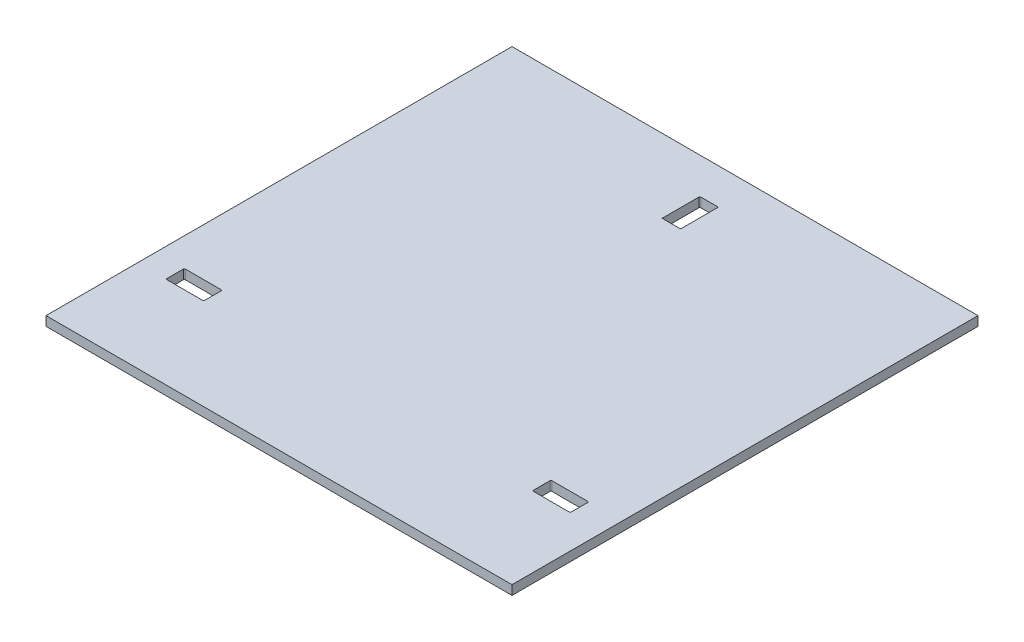
ISO-10303-21;
HEADER;
FILE_DESCRIPTION(('STEP AP214'),'2;1');
FILE_NAME('part.step','',(''),(''),'','','');
FILE_SCHEMA(('AUTOMOTIVE_DESIGN { 1 0 10303 214 1 1 1 1 }'));
ENDSEC;
DATA;
#1=APPLICATION_CONTEXT('core data for automotive mechanical design processes');
#2=APPLICATION_PROTOCOL_DEFINITION('international standard','automotive_design',2000,#1);
#3=PRODUCT_CONTEXT('',#1,'mechanical');
#4=PRODUCT('Part','Part','',(#3));
#5=PRODUCT_RELATED_PRODUCT_CATEGORY('part','',(#4));
#6=PRODUCT_DEFINITION_FORMATION('','',#4);
#7=PRODUCT_DEFINITION_CONTEXT('part definition',#1,'design');
#8=PRODUCT_DEFINITION('design','',#6,#7);
#9=PRODUCT_DEFINITION_SHAPE('','',#8);
#10=(LENGTH_UNIT() NAMED_UNIT(*) SI_UNIT(.MILLI.,.METRE.));
#11=(NAMED_UNIT(*) PLANE_ANGLE_UNIT() SI_UNIT($,.RADIAN.));
#12=(NAMED_UNIT(*) SI_UNIT($,.STERADIAN.) SOLID_ANGLE_UNIT());
#13=UNCERTAINTY_MEASURE_WITH_UNIT(LENGTH_MEASURE(1.E-05),#10,'distance_accuracy_value','');
#14=(GEOMETRIC_REPRESENTATION_CONTEXT(3) GLOBAL_UNCERTAINTY_ASSIGNED_CONTEXT((#13)) GLOBAL_UNIT_ASSIGNED_CONTEXT((#10,
#11,#12)) REPRESENTATION_CONTEXT('',''));
#15=CARTESIAN_POINT('',(0.,0.,0.));
#16=DIRECTION('',(0.,0.,1.));
#17=DIRECTION('',(1.,0.,0.));
#18=AXIS2_PLACEMENT_3D('',#15,#16,#17);
#19=CARTESIAN_POINT('',(0.,10.,0.));
#20=DIRECTION('',(1.,0.,0.));
#21=DIRECTION('',(0.,0.,-1.));
#22=AXIS2_PLACEMENT_3D('',#19,#20,#21);
#23=PLANE('',#22);
#24=DIRECTION('',(0.,0.,1.));
#25=VECTOR('',#24,1.);
#26=CARTESIAN_POINT('',(0.,0.,0.));
#27=LINE('',#26,#25);
#28=CARTESIAN_POINT('',(0.,0.,-500.));
#29=VERTEX_POINT('',#28);
#30=CARTESIAN_POINT('',(0.,0.,0.));
#31=VERTEX_POINT('',#30);
#32=EDGE_CURVE('E288',#29,#31,#27,.T.);
#33=ORIENTED_EDGE('',*,*,#32,.T.);
#34=DIRECTION('',(0.,-1.,0.));
#35=VECTOR('',#34,1.);
#36=CARTESIAN_POINT('',(0.,10.,0.));
#37=LINE('',#36,#35);
#38=CARTESIAN_POINT('',(0.,10.,0.));
#39=VERTEX_POINT('',#38);
#40=EDGE_CURVE('E325',#39,#31,#37,.T.);
#41=ORIENTED_EDGE('',*,*,#40,.F.);
#42=DIRECTION('',(0.,0.,1.));
#43=VECTOR('',#42,1.);
#44=CARTESIAN_POINT('',(0.,10.,0.));
#45=LINE('',#44,#43);
#46=CARTESIAN_POINT('',(0.,10.,-500.));
#47=VERTEX_POINT('',#46);
#48=EDGE_CURVE('E299',#47,#39,#45,.T.);
#49=ORIENTED_EDGE('',*,*,#48,.F.);
#50=DIRECTION('',(0.,-1.,0.));
#51=VECTOR('',#50,1.);
#52=CARTESIAN_POINT('',(0.,10.,-500.));
#53=LINE('',#52,#51);
#54=EDGE_CURVE('E309',#47,#29,#53,.T.);
#55=ORIENTED_EDGE('',*,*,#54,.T.);
#56=EDGE_LOOP('',(#33,#41,#49,#55));
#57=FACE_BOUND('',#56,.T.);
#58=ADVANCED_FACE('F35',(#57),#23,.F.);
#59=CARTESIAN_POINT('',(0.,10.,0.));
#60=DIRECTION('',(0.,0.,-1.));
#61=DIRECTION('',(-1.,0.,0.));
#62=AXIS2_PLACEMENT_3D('',#59,#60,#61);
#63=PLANE('',#62);
#64=DIRECTION('',(1.,0.,0.));
#65=VECTOR('',#64,1.);
#66=CARTESIAN_POINT('',(0.,0.,0.));
#67=LINE('',#66,#65);
#68=CARTESIAN_POINT('',(500.,0.,0.));
#69=VERTEX_POINT('',#68);
#70=EDGE_CURVE('E312',#31,#69,#67,.T.);
#71=ORIENTED_EDGE('',*,*,#70,.T.);
#72=DIRECTION('',(0.,-1.,0.));
#73=VECTOR('',#72,1.);
#74=CARTESIAN_POINT('',(500.,10.,0.));
#75=LINE('',#74,#73);
#76=CARTESIAN_POINT('',(500.,10.,0.));
#77=VERTEX_POINT('',#76);
#78=EDGE_CURVE('E322',#77,#69,#75,.T.);
#79=ORIENTED_EDGE('',*,*,#78,.F.);
#80=DIRECTION('',(1.,0.,0.));
#81=VECTOR('',#80,1.);
#82=CARTESIAN_POINT('',(0.,10.,0.));
#83=LINE('',#82,#81);
#84=EDGE_CURVE('E302',#39,#77,#83,.T.);
#85=ORIENTED_EDGE('',*,*,#84,.F.);
#86=ORIENTED_EDGE('',*,*,#40,.T.);
#87=EDGE_LOOP('',(#71,#79,#85,#86));
#88=FACE_BOUND('',#87,.T.);
#89=ADVANCED_FACE('F473',(#88),#63,.F.);
#90=CARTESIAN_POINT('',(500.,10.,0.));
#91=DIRECTION('',(-1.,0.,0.));
#92=DIRECTION('',(0.,0.,1.));
#93=AXIS2_PLACEMENT_3D('',#90,#91,#92);
#94=PLANE('',#93);
#95=DIRECTION('',(0.,0.,-1.));
#96=VECTOR('',#95,1.);
#97=CARTESIAN_POINT('',(500.,0.,0.));
#98=LINE('',#97,#96);
#99=CARTESIAN_POINT('',(500.,0.,-500.));
#100=VERTEX_POINT('',#99);
#101=EDGE_CURVE('E314',#69,#100,#98,.T.);
#102=ORIENTED_EDGE('',*,*,#101,.T.);
#103=DIRECTION('',(0.,-1.,0.));
#104=VECTOR('',#103,1.);
#105=CARTESIAN_POINT('',(500.,10.,-500.));
#106=LINE('',#105,#104);
#107=CARTESIAN_POINT('',(500.,10.,-500.));
#108=VERTEX_POINT('',#107);
#109=EDGE_CURVE('E319',#108,#100,#106,.T.);
#110=ORIENTED_EDGE('',*,*,#109,.F.);
#111=DIRECTION('',(0.,0.,-1.));
#112=VECTOR('',#111,1.);
#113=CARTESIAN_POINT('',(500.,10.,0.));
#114=LINE('',#113,#112);
#115=EDGE_CURVE('E305',#77,#108,#114,.T.);
#116=ORIENTED_EDGE('',*,*,#115,.F.);
#117=ORIENTED_EDGE('',*,*,#78,.T.);
#118=EDGE_LOOP('',(#102,#110,#116,#117));
#119=FACE_BOUND('',#118,.T.);
#120=ADVANCED_FACE('F479',(#119),#94,.F.);
#121=CARTESIAN_POINT('',(0.,10.,-500.));
#122=DIRECTION('',(0.,0.,1.));
#123=DIRECTION('',(1.,0.,0.));
#124=AXIS2_PLACEMENT_3D('',#121,#122,#123);
#125=PLANE('',#124);
#126=DIRECTION('',(-1.,0.,0.));
#127=VECTOR('',#126,1.);
#128=CARTESIAN_POINT('',(0.,0.,-500.));
#129=LINE('',#128,#127);
#130=EDGE_CURVE('E303',#100,#29,#129,.T.);
#131=ORIENTED_EDGE('',*,*,#130,.T.);
#132=ORIENTED_EDGE('',*,*,#54,.F.);
#133=DIRECTION('',(-1.,0.,0.));
#134=VECTOR('',#133,1.);
#135=CARTESIAN_POINT('',(0.,10.,-500.));
#136=LINE('',#135,#134);
#137=EDGE_CURVE('E307',#108,#47,#136,.T.);
#138=ORIENTED_EDGE('',*,*,#137,.F.);
#139=ORIENTED_EDGE('',*,*,#109,.T.);
#140=EDGE_LOOP('',(#131,#132,#138,#139));
#141=FACE_BOUND('',#140,.T.);
#142=ADVANCED_FACE('F529',(#141),#125,.F.);
#143=CARTESIAN_POINT('',(0.,10.,0.));
#144=DIRECTION('',(0.,-1.,0.));
#145=DIRECTION('',(0.,0.,-1.));
#146=AXIS2_PLACEMENT_3D('',#143,#144,#145);
#147=PLANE('',#146);
#148=DIRECTION('',(1.,0.,0.));
#149=VECTOR('',#148,1.);
#150=CARTESIAN_POINT('',(240.1,10.,-420.975372138322));
#151=LINE('',#150,#149);
#152=CARTESIAN_POINT('',(240.1,10.,-420.975372138322));
#153=VERTEX_POINT('',#152);
#154=CARTESIAN_POINT('',(258.9,10.,-420.975372138322));
#155=VERTEX_POINT('',#154);
#156=EDGE_CURVE('E244',#153,#155,#151,.T.);
#157=ORIENTED_EDGE('',*,*,#156,.F.);
#158=DIRECTION('',(0.,0.,1.));
#159=VECTOR('',#158,1.);
#160=CARTESIAN_POINT('',(240.1,10.,-420.975372138322));
#161=LINE('',#160,#159);
#162=CARTESIAN_POINT('',(240.1,10.,-460.475372138322));
#163=VERTEX_POINT('',#162);
#164=EDGE_CURVE('E227',#163,#153,#161,.T.);
#165=ORIENTED_EDGE('',*,*,#164,.F.);
#166=CARTESIAN_POINT('',(241.1,10.,-460.475372138322));
#167=DIRECTION('',(0.,-1.,0.));
#168=DIRECTION('',(0.,0.,-1.));
#169=AXIS2_PLACEMENT_3D('',#166,#167,#168);
#170=CIRCLE('',#169,1.);
#171=CARTESIAN_POINT('',(241.1,10.,-461.475372138322));
#172=VERTEX_POINT('',#171);
#173=EDGE_CURVE('E58',#163,#172,#170,.T.);
#174=ORIENTED_EDGE('',*,*,#173,.T.);
#175=DIRECTION('',(-1.,0.,0.));
#176=VECTOR('',#175,1.);
#177=CARTESIAN_POINT('',(240.1,10.,-461.475372138322));
#178=LINE('',#177,#176);
#179=CARTESIAN_POINT('',(258.9,10.,-461.475372138322));
#180=VERTEX_POINT('',#179);
#181=EDGE_CURVE('E221',#180,#172,#178,.T.);
#182=ORIENTED_EDGE('',*,*,#181,.F.);
#183=CARTESIAN_POINT('',(258.9,10.,-460.475372138322));
#184=DIRECTION('',(0.,-1.,0.));
#185=DIRECTION('',(0.,0.,-1.));
#186=AXIS2_PLACEMENT_3D('',#183,#184,#185);
#187=CIRCLE('',#186,1.);
#188=CARTESIAN_POINT('',(259.9,10.,-460.475372138322));
#189=VERTEX_POINT('',#188);
#190=EDGE_CURVE('E405',#180,#189,#187,.T.);
#191=ORIENTED_EDGE('',*,*,#190,.T.);
#192=DIRECTION('',(0.,0.,-1.));
#193=VECTOR('',#192,1.);
#194=CARTESIAN_POINT('',(259.9,10.,-420.975372138322));
#195=LINE('',#194,#193);
#196=CARTESIAN_POINT('',(259.9,10.,-421.975372138322));
#197=VERTEX_POINT('',#196);
#198=EDGE_CURVE('E246',#197,#189,#195,.T.);
#199=ORIENTED_EDGE('',*,*,#198,.F.);
#200=CARTESIAN_POINT('',(258.9,10.,-421.975372138322));
#201=DIRECTION('',(0.,-1.,0.));
#202=DIRECTION('',(0.,0.,-1.));
#203=AXIS2_PLACEMENT_3D('',#200,#201,#202);
#204=CIRCLE('',#203,1.);
#205=EDGE_CURVE('E397',#197,#155,#204,.T.);
#206=ORIENTED_EDGE('',*,*,#205,.T.);
#207=EDGE_LOOP('',(#157,#165,#174,#182,#191,#199,#206));
#208=FACE_BOUND('',#207,.T.);
#209=DIRECTION('',(1.,0.,0.));
#210=VECTOR('',#209,1.);
#211=CARTESIAN_POINT('',(423.771393457051,10.,-98.2226751332545));
#212=LINE('',#211,#210);
#213=CARTESIAN_POINT('',(424.771393457051,10.,-98.2226751332545));
#214=VERTEX_POINT('',#213);
#215=CARTESIAN_POINT('',(463.271393457051,10.,-98.2226751332545));
#216=VERTEX_POINT('',#215);
#217=EDGE_CURVE('E267',#214,#216,#212,.T.);
#218=ORIENTED_EDGE('',*,*,#217,.F.);
#219=CARTESIAN_POINT('',(424.771393457051,10.,-99.2226751332545));
#220=DIRECTION('',(0.,-1.,0.));
#221=DIRECTION('',(0.,0.,-1.));
#222=AXIS2_PLACEMENT_3D('',#219,#220,#221);
#223=CIRCLE('',#222,1.);
#224=CARTESIAN_POINT('',(423.771393457051,10.,-99.2226751332545));
#225=VERTEX_POINT('',#224);
#226=EDGE_CURVE('E381',#214,#225,#223,.T.);
#227=ORIENTED_EDGE('',*,*,#226,.T.);
#228=DIRECTION('',(0.,0.,1.));
#229=VECTOR('',#228,1.);
#230=CARTESIAN_POINT('',(423.771393457051,10.,-98.2226751332545));
#231=LINE('',#230,#229);
#232=CARTESIAN_POINT('',(423.771393457051,10.,-117.022675133254));
#233=VERTEX_POINT('',#232);
#234=EDGE_CURVE('E231',#233,#225,#231,.T.);
#235=ORIENTED_EDGE('',*,*,#234,.F.);
#236=CARTESIAN_POINT('',(424.771393457051,10.,-117.022675133254));
#237=DIRECTION('',(0.,-1.,0.));
#238=DIRECTION('',(0.,0.,-1.));
#239=AXIS2_PLACEMENT_3D('',#236,#237,#238);
#240=CIRCLE('',#239,1.);
#241=CARTESIAN_POINT('',(424.771393457051,10.,-118.022675133254));
#242=VERTEX_POINT('',#241);
#243=EDGE_CURVE('E413',#233,#242,#240,.T.);
#244=ORIENTED_EDGE('',*,*,#243,.T.);
#245=DIRECTION('',(-1.,0.,0.));
#246=VECTOR('',#245,1.);
#247=CARTESIAN_POINT('',(423.771393457051,10.,-118.022675133254));
#248=LINE('',#247,#246);
#249=CARTESIAN_POINT('',(463.271393457051,10.,-118.022675133254));
#250=VERTEX_POINT('',#249);
#251=EDGE_CURVE('E255',#250,#242,#248,.T.);
#252=ORIENTED_EDGE('',*,*,#251,.F.);
#253=CARTESIAN_POINT('',(463.271393457051,10.,-117.022675133254));
#254=DIRECTION('',(0.,-1.,0.));
#255=DIRECTION('',(0.,0.,-1.));
#256=AXIS2_PLACEMENT_3D('',#253,#254,#255);
#257=CIRCLE('',#256,1.);
#258=CARTESIAN_POINT('',(464.271393457051,10.,-117.022675133254));
#259=VERTEX_POINT('',#258);
#260=EDGE_CURVE('E409',#250,#259,#257,.T.);
#261=ORIENTED_EDGE('',*,*,#260,.T.);
#262=DIRECTION('',(0.,0.,-1.));
#263=VECTOR('',#262,1.);
#264=CARTESIAN_POINT('',(464.271393457051,10.,-98.2226751332545));
#265=LINE('',#264,#263);
#266=CARTESIAN_POINT('',(464.271393457051,10.,-99.2226751332545));
#267=VERTEX_POINT('',#266);
#268=EDGE_CURVE('E270',#267,#259,#265,.T.);
#269=ORIENTED_EDGE('',*,*,#268,.F.);
#270=CARTESIAN_POINT('',(463.271393457051,10.,-99.2226751332545));
#271=DIRECTION('',(0.,-1.,0.));
#272=DIRECTION('',(0.,0.,-1.));
#273=AXIS2_PLACEMENT_3D('',#270,#271,#272);
#274=CIRCLE('',#273,1.);
#275=EDGE_CURVE('E393',#267,#216,#274,.T.);
#276=ORIENTED_EDGE('',*,*,#275,.T.);
#277=EDGE_LOOP('',(#218,#227,#235,#244,#252,#261,#269,#276));
#278=FACE_BOUND('',#277,.T.);
#279=DIRECTION('',(1.,0.,0.));
#280=VECTOR('',#279,1.);
#281=CARTESIAN_POINT('',(30.4219999641472,10.,-98.2226751332545));
#282=LINE('',#281,#280);
#283=CARTESIAN_POINT('',(31.4219999641472,10.,-98.2226751332545));
#284=VERTEX_POINT('',#283);
#285=CARTESIAN_POINT('',(69.9219999641472,10.,-98.2226751332545));
#286=VERTEX_POINT('',#285);
#287=EDGE_CURVE('E291',#284,#286,#282,.T.);
#288=ORIENTED_EDGE('',*,*,#287,.F.);
#289=CARTESIAN_POINT('',(31.4219999641472,10.,-99.2226751332545));
#290=DIRECTION('',(0.,-1.,0.));
#291=DIRECTION('',(0.,0.,-1.));
#292=AXIS2_PLACEMENT_3D('',#289,#290,#291);
#293=CIRCLE('',#292,1.);
#294=CARTESIAN_POINT('',(30.4219999641472,10.,-99.2226751332545));
#295=VERTEX_POINT('',#294);
#296=EDGE_CURVE('E385',#284,#295,#293,.T.);
#297=ORIENTED_EDGE('',*,*,#296,.T.);
#298=DIRECTION('',(0.,0.,1.));
#299=VECTOR('',#298,1.);
#300=CARTESIAN_POINT('',(30.4219999641472,10.,-118.022675133254));
#301=LINE('',#300,#299);
#302=CARTESIAN_POINT('',(30.4219999641472,10.,-117.022675133254));
#303=VERTEX_POINT('',#302);
#304=EDGE_CURVE('E264',#303,#295,#301,.T.);
#305=ORIENTED_EDGE('',*,*,#304,.F.);
#306=CARTESIAN_POINT('',(31.4219999641472,10.,-117.022675133254));
#307=DIRECTION('',(0.,-1.,0.));
#308=DIRECTION('',(0.,0.,-1.));
#309=AXIS2_PLACEMENT_3D('',#306,#307,#308);
#310=CIRCLE('',#309,1.);
#311=CARTESIAN_POINT('',(31.4219999641472,10.,-118.022675133254));
#312=VERTEX_POINT('',#311);
#313=EDGE_CURVE('E43',#303,#312,#310,.T.);
#314=ORIENTED_EDGE('',*,*,#313,.T.);
#315=DIRECTION('',(-1.,0.,0.));
#316=VECTOR('',#315,1.);
#317=CARTESIAN_POINT('',(30.4219999641472,10.,-118.022675133254));
#318=LINE('',#317,#316);
#319=CARTESIAN_POINT('',(69.9219999641472,10.,-118.022675133254));
#320=VERTEX_POINT('',#319);
#321=EDGE_CURVE('E279',#320,#312,#318,.T.);
#322=ORIENTED_EDGE('',*,*,#321,.F.);
#323=CARTESIAN_POINT('',(69.9219999641472,10.,-117.022675133254));
#324=DIRECTION('',(0.,-1.,0.));
#325=DIRECTION('',(0.,0.,-1.));
#326=AXIS2_PLACEMENT_3D('',#323,#324,#325);
#327=CIRCLE('',#326,1.);
#328=CARTESIAN_POINT('',(70.9219999641472,10.,-117.022675133254));
#329=VERTEX_POINT('',#328);
#330=EDGE_CURVE('E401',#320,#329,#327,.T.);
#331=ORIENTED_EDGE('',*,*,#330,.T.);
#332=DIRECTION('',(0.,0.,-1.));
#333=VECTOR('',#332,1.);
#334=CARTESIAN_POINT('',(70.9219999641472,10.,-118.022675133254));
#335=LINE('',#334,#333);
#336=CARTESIAN_POINT('',(70.9219999641472,10.,-99.2226751332545));
#337=VERTEX_POINT('',#336);
#338=EDGE_CURVE('E294',#337,#329,#335,.T.);
#339=ORIENTED_EDGE('',*,*,#338,.F.);
#340=CARTESIAN_POINT('',(69.9219999641472,10.,-99.2226751332545));
#341=DIRECTION('',(0.,-1.,0.));
#342=DIRECTION('',(0.,0.,-1.));
#343=AXIS2_PLACEMENT_3D('',#340,#341,#342);
#344=CIRCLE('',#343,1.);
#345=EDGE_CURVE('E389',#337,#286,#344,.T.);
#346=ORIENTED_EDGE('',*,*,#345,.T.);
#347=EDGE_LOOP('',(#288,#297,#305,#314,#322,#331,#339,#346));
#348=FACE_BOUND('',#347,.T.);
#349=ORIENTED_EDGE('',*,*,#48,.T.);
#350=ORIENTED_EDGE('',*,*,#84,.T.);
#351=ORIENTED_EDGE('',*,*,#115,.T.);
#352=ORIENTED_EDGE('',*,*,#137,.T.);
#353=EDGE_LOOP('',(#349,#350,#351,#352));
#354=FACE_BOUND('',#353,.T.);
#355=ADVANCED_FACE('F422',(#208,#278,#348,#354),#147,.F.);
#356=CARTESIAN_POINT('',(0.,0.,0.));
#357=DIRECTION('',(0.,-1.,0.));
#358=DIRECTION('',(0.,0.,-1.));
#359=AXIS2_PLACEMENT_3D('',#356,#357,#358);
#360=PLANE('',#359);
#361=DIRECTION('',(-1.,0.,0.));
#362=VECTOR('',#361,1.);
#363=CARTESIAN_POINT('',(240.1,0.,-461.475372138322));
#364=LINE('',#363,#362);
#365=CARTESIAN_POINT('',(258.9,0.,-461.475372138322));
#366=VERTEX_POINT('',#365);
#367=CARTESIAN_POINT('',(241.1,0.,-461.475372138322));
#368=VERTEX_POINT('',#367);
#369=EDGE_CURVE('E232',#366,#368,#364,.T.);
#370=ORIENTED_EDGE('',*,*,#369,.T.);
#371=CARTESIAN_POINT('',(241.1,0.,-460.475372138322));
#372=DIRECTION('',(0.,-1.,0.));
#373=DIRECTION('',(0.,0.,-1.));
#374=AXIS2_PLACEMENT_3D('',#371,#372,#373);
#375=CIRCLE('',#374,1.);
#376=CARTESIAN_POINT('',(240.1,0.,-460.475372138322));
#377=VERTEX_POINT('',#376);
#378=EDGE_CURVE('E50',#368,#377,#375,.F.);
#379=ORIENTED_EDGE('',*,*,#378,.T.);
#380=DIRECTION('',(0.,0.,1.));
#381=VECTOR('',#380,1.);
#382=CARTESIAN_POINT('',(240.1,0.,-420.975372138322));
#383=LINE('',#382,#381);
#384=CARTESIAN_POINT('',(240.1,0.,-420.975372138322));
#385=VERTEX_POINT('',#384);
#386=EDGE_CURVE('E213',#377,#385,#383,.T.);
#387=ORIENTED_EDGE('',*,*,#386,.T.);
#388=DIRECTION('',(1.,0.,0.));
#389=VECTOR('',#388,1.);
#390=CARTESIAN_POINT('',(240.1,0.,-420.975372138322));
#391=LINE('',#390,#389);
#392=CARTESIAN_POINT('',(258.9,0.,-420.975372138322));
#393=VERTEX_POINT('',#392);
#394=EDGE_CURVE('E218',#385,#393,#391,.T.);
#395=ORIENTED_EDGE('',*,*,#394,.T.);
#396=CARTESIAN_POINT('',(258.9,0.,-421.975372138322));
#397=DIRECTION('',(0.,-1.,0.));
#398=DIRECTION('',(0.,0.,-1.));
#399=AXIS2_PLACEMENT_3D('',#396,#397,#398);
#400=CIRCLE('',#399,1.);
#401=CARTESIAN_POINT('',(259.9,0.,-421.975372138322));
#402=VERTEX_POINT('',#401);
#403=EDGE_CURVE('E399',#393,#402,#400,.F.);
#404=ORIENTED_EDGE('',*,*,#403,.T.);
#405=DIRECTION('',(0.,0.,-1.));
#406=VECTOR('',#405,1.);
#407=CARTESIAN_POINT('',(259.9,0.,-420.975372138322));
#408=LINE('',#407,#406);
#409=CARTESIAN_POINT('',(259.9,0.,-460.475372138322));
#410=VERTEX_POINT('',#409);
#411=EDGE_CURVE('E237',#402,#410,#408,.T.);
#412=ORIENTED_EDGE('',*,*,#411,.T.);
#413=CARTESIAN_POINT('',(258.9,0.,-460.475372138322));
#414=DIRECTION('',(0.,-1.,0.));
#415=DIRECTION('',(0.,0.,-1.));
#416=AXIS2_PLACEMENT_3D('',#413,#414,#415);
#417=CIRCLE('',#416,1.);
#418=EDGE_CURVE('E407',#410,#366,#417,.F.);
#419=ORIENTED_EDGE('',*,*,#418,.T.);
#420=EDGE_LOOP('',(#370,#379,#387,#395,#404,#412,#419));
#421=FACE_BOUND('',#420,.T.);
#422=DIRECTION('',(-1.,0.,0.));
#423=VECTOR('',#422,1.);
#424=CARTESIAN_POINT('',(423.771393457051,0.,-118.022675133254));
#425=LINE('',#424,#423);
#426=CARTESIAN_POINT('',(463.271393457051,0.,-118.022675133254));
#427=VERTEX_POINT('',#426);
#428=CARTESIAN_POINT('',(424.771393457051,0.,-118.022675133254));
#429=VERTEX_POINT('',#428);
#430=EDGE_CURVE('E261',#427,#429,#425,.T.);
#431=ORIENTED_EDGE('',*,*,#430,.T.);
#432=CARTESIAN_POINT('',(424.771393457051,0.,-117.022675133254));
#433=DIRECTION('',(0.,-1.,0.));
#434=DIRECTION('',(0.,0.,-1.));
#435=AXIS2_PLACEMENT_3D('',#432,#433,#434);
#436=CIRCLE('',#435,1.);
#437=CARTESIAN_POINT('',(423.771393457051,0.,-117.022675133254));
#438=VERTEX_POINT('',#437);
#439=EDGE_CURVE('E415',#429,#438,#436,.F.);
#440=ORIENTED_EDGE('',*,*,#439,.T.);
#441=DIRECTION('',(0.,0.,1.));
#442=VECTOR('',#441,1.);
#443=CARTESIAN_POINT('',(423.771393457051,0.,-98.2226751332545));
#444=LINE('',#443,#442);
#445=CARTESIAN_POINT('',(423.771393457051,0.,-99.2226751332545));
#446=VERTEX_POINT('',#445);
#447=EDGE_CURVE('E251',#438,#446,#444,.T.);
#448=ORIENTED_EDGE('',*,*,#447,.T.);
#449=CARTESIAN_POINT('',(424.771393457051,0.,-99.2226751332545));
#450=DIRECTION('',(0.,-1.,0.));
#451=DIRECTION('',(0.,0.,-1.));
#452=AXIS2_PLACEMENT_3D('',#449,#450,#451);
#453=CIRCLE('',#452,1.);
#454=CARTESIAN_POINT('',(424.771393457051,0.,-98.2226751332545));
#455=VERTEX_POINT('',#454);
#456=EDGE_CURVE('E383',#446,#455,#453,.F.);
#457=ORIENTED_EDGE('',*,*,#456,.T.);
#458=DIRECTION('',(1.,0.,0.));
#459=VECTOR('',#458,1.);
#460=CARTESIAN_POINT('',(423.771393457051,0.,-98.2226751332545));
#461=LINE('',#460,#459);
#462=CARTESIAN_POINT('',(463.271393457051,0.,-98.2226751332545));
#463=VERTEX_POINT('',#462);
#464=EDGE_CURVE('E254',#455,#463,#461,.T.);
#465=ORIENTED_EDGE('',*,*,#464,.T.);
#466=CARTESIAN_POINT('',(463.271393457051,0.,-99.2226751332545));
#467=DIRECTION('',(0.,-1.,0.));
#468=DIRECTION('',(0.,0.,-1.));
#469=AXIS2_PLACEMENT_3D('',#466,#467,#468);
#470=CIRCLE('',#469,1.);
#471=CARTESIAN_POINT('',(464.271393457051,0.,-99.2226751332545));
#472=VERTEX_POINT('',#471);
#473=EDGE_CURVE('E395',#463,#472,#470,.F.);
#474=ORIENTED_EDGE('',*,*,#473,.T.);
#475=DIRECTION('',(0.,0.,-1.));
#476=VECTOR('',#475,1.);
#477=CARTESIAN_POINT('',(464.271393457051,0.,-98.2226751332545));
#478=LINE('',#477,#476);
#479=CARTESIAN_POINT('',(464.271393457051,0.,-117.022675133254));
#480=VERTEX_POINT('',#479);
#481=EDGE_CURVE('E258',#472,#480,#478,.T.);
#482=ORIENTED_EDGE('',*,*,#481,.T.);
#483=CARTESIAN_POINT('',(463.271393457051,0.,-117.022675133254));
#484=DIRECTION('',(0.,-1.,0.));
#485=DIRECTION('',(0.,0.,-1.));
#486=AXIS2_PLACEMENT_3D('',#483,#484,#485);
#487=CIRCLE('',#486,1.);
#488=EDGE_CURVE('E411',#480,#427,#487,.F.);
#489=ORIENTED_EDGE('',*,*,#488,.T.);
#490=EDGE_LOOP('',(#431,#440,#448,#457,#465,#474,#482,#489));
#491=FACE_BOUND('',#490,.T.);
#492=DIRECTION('',(-1.,0.,0.));
#493=VECTOR('',#492,1.);
#494=CARTESIAN_POINT('',(30.4219999641472,0.,-118.022675133254));
#495=LINE('',#494,#493);
#496=CARTESIAN_POINT('',(69.9219999641472,0.,-118.022675133254));
#497=VERTEX_POINT('',#496);
#498=CARTESIAN_POINT('',(31.4219999641472,0.,-118.022675133254));
#499=VERTEX_POINT('',#498);
#500=EDGE_CURVE('E285',#497,#499,#495,.T.);
#501=ORIENTED_EDGE('',*,*,#500,.T.);
#502=CARTESIAN_POINT('',(31.4219999641472,0.,-117.022675133254));
#503=DIRECTION('',(0.,-1.,0.));
#504=DIRECTION('',(0.,0.,-1.));
#505=AXIS2_PLACEMENT_3D('',#502,#503,#504);
#506=CIRCLE('',#505,1.);
#507=CARTESIAN_POINT('',(30.4219999641472,0.,-117.022675133254));
#508=VERTEX_POINT('',#507);
#509=EDGE_CURVE('E11',#499,#508,#506,.F.);
#510=ORIENTED_EDGE('',*,*,#509,.T.);
#511=DIRECTION('',(0.,0.,1.));
#512=VECTOR('',#511,1.);
#513=CARTESIAN_POINT('',(30.4219999641472,0.,-118.022675133254));
#514=LINE('',#513,#512);
#515=CARTESIAN_POINT('',(30.4219999641472,0.,-99.2226751332545));
#516=VERTEX_POINT('',#515);
#517=EDGE_CURVE('E275',#508,#516,#514,.T.);
#518=ORIENTED_EDGE('',*,*,#517,.T.);
#519=CARTESIAN_POINT('',(31.4219999641472,0.,-99.2226751332545));
#520=DIRECTION('',(0.,-1.,0.));
#521=DIRECTION('',(0.,0.,-1.));
#522=AXIS2_PLACEMENT_3D('',#519,#520,#521);
#523=CIRCLE('',#522,1.);
#524=CARTESIAN_POINT('',(31.4219999641472,0.,-98.2226751332545));
#525=VERTEX_POINT('',#524);
#526=EDGE_CURVE('E387',#516,#525,#523,.F.);
#527=ORIENTED_EDGE('',*,*,#526,.T.);
#528=DIRECTION('',(1.,0.,0.));
#529=VECTOR('',#528,1.);
#530=CARTESIAN_POINT('',(30.4219999641472,0.,-98.2226751332545));
#531=LINE('',#530,#529);
#532=CARTESIAN_POINT('',(69.9219999641472,0.,-98.2226751332545));
#533=VERTEX_POINT('',#532);
#534=EDGE_CURVE('E278',#525,#533,#531,.T.);
#535=ORIENTED_EDGE('',*,*,#534,.T.);
#536=CARTESIAN_POINT('',(69.9219999641472,0.,-99.2226751332545));
#537=DIRECTION('',(0.,-1.,0.));
#538=DIRECTION('',(0.,0.,-1.));
#539=AXIS2_PLACEMENT_3D('',#536,#537,#538);
#540=CIRCLE('',#539,1.);
#541=CARTESIAN_POINT('',(70.9219999641472,0.,-99.2226751332545));
#542=VERTEX_POINT('',#541);
#543=EDGE_CURVE('E391',#533,#542,#540,.F.);
#544=ORIENTED_EDGE('',*,*,#543,.T.);
#545=DIRECTION('',(0.,0.,-1.));
#546=VECTOR('',#545,1.);
#547=CARTESIAN_POINT('',(70.9219999641472,0.,-118.022675133254));
#548=LINE('',#547,#546);
#549=CARTESIAN_POINT('',(70.9219999641472,0.,-117.022675133254));
#550=VERTEX_POINT('',#549);
#551=EDGE_CURVE('E282',#542,#550,#548,.T.);
#552=ORIENTED_EDGE('',*,*,#551,.T.);
#553=CARTESIAN_POINT('',(69.9219999641472,0.,-117.022675133254));
#554=DIRECTION('',(0.,-1.,0.));
#555=DIRECTION('',(0.,0.,-1.));
#556=AXIS2_PLACEMENT_3D('',#553,#554,#555);
#557=CIRCLE('',#556,1.);
#558=EDGE_CURVE('E403',#550,#497,#557,.F.);
#559=ORIENTED_EDGE('',*,*,#558,.T.);
#560=EDGE_LOOP('',(#501,#510,#518,#527,#535,#544,#552,#559));
#561=FACE_BOUND('',#560,.T.);
#562=ORIENTED_EDGE('',*,*,#32,.F.);
#563=ORIENTED_EDGE('',*,*,#130,.F.);
#564=ORIENTED_EDGE('',*,*,#101,.F.);
#565=ORIENTED_EDGE('',*,*,#70,.F.);
#566=EDGE_LOOP('',(#562,#563,#564,#565));
#567=FACE_BOUND('',#566,.T.);
#568=ADVANCED_FACE('F215',(#421,#491,#561,#567),#360,.T.);
#569=CARTESIAN_POINT('',(30.4219999641472,0.,-118.022675133254));
#570=DIRECTION('',(-1.,0.,0.));
#571=DIRECTION('',(0.,0.,1.));
#572=AXIS2_PLACEMENT_3D('',#569,#570,#571);
#573=PLANE('',#572);
#574=ORIENTED_EDGE('',*,*,#304,.T.);
#575=DIRECTION('',(0.,1.,0.));
#576=VECTOR('',#575,1.);
#577=CARTESIAN_POINT('',(30.4219999641472,0.,-99.2226751332545));
#578=LINE('',#577,#576);
#579=EDGE_CURVE('E346',#295,#516,#578,.F.);
#580=ORIENTED_EDGE('',*,*,#579,.T.);
#581=ORIENTED_EDGE('',*,*,#517,.F.);
#582=DIRECTION('',(0.,1.,0.));
#583=VECTOR('',#582,1.);
#584=CARTESIAN_POINT('',(30.4219999641472,10.,-117.022675133254));
#585=LINE('',#584,#583);
#586=EDGE_CURVE('E343',#508,#303,#585,.T.);
#587=ORIENTED_EDGE('',*,*,#586,.T.);
#588=EDGE_LOOP('',(#574,#580,#581,#587));
#589=FACE_BOUND('',#588,.T.);
#590=ADVANCED_FACE('F437',(#589),#573,.F.);
#591=CARTESIAN_POINT('',(30.4219999641472,0.,-118.022675133254));
#592=DIRECTION('',(0.,0.,-1.));
#593=DIRECTION('',(-1.,0.,0.));
#594=AXIS2_PLACEMENT_3D('',#591,#592,#593);
#595=PLANE('',#594);
#596=ORIENTED_EDGE('',*,*,#500,.F.);
#597=DIRECTION('',(0.,1.,0.));
#598=VECTOR('',#597,1.);
#599=CARTESIAN_POINT('',(69.9219999641472,10.,-118.022675133254));
#600=LINE('',#599,#598);
#601=EDGE_CURVE('E366',#497,#320,#600,.T.);
#602=ORIENTED_EDGE('',*,*,#601,.T.);
#603=ORIENTED_EDGE('',*,*,#321,.T.);
#604=DIRECTION('',(0.,1.,0.));
#605=VECTOR('',#604,1.);
#606=CARTESIAN_POINT('',(31.4219999641472,0.,-118.022675133254));
#607=LINE('',#606,#605);
#608=EDGE_CURVE('E364',#312,#499,#607,.F.);
#609=ORIENTED_EDGE('',*,*,#608,.T.);
#610=EDGE_LOOP('',(#596,#602,#603,#609));
#611=FACE_BOUND('',#610,.T.);
#612=ADVANCED_FACE('F429',(#611),#595,.F.);
#613=CARTESIAN_POINT('',(70.9219999641472,0.,-118.022675133254));
#614=DIRECTION('',(1.,0.,0.));
#615=DIRECTION('',(0.,0.,-1.));
#616=AXIS2_PLACEMENT_3D('',#613,#614,#615);
#617=PLANE('',#616);
#618=ORIENTED_EDGE('',*,*,#551,.F.);
#619=DIRECTION('',(0.,1.,0.));
#620=VECTOR('',#619,1.);
#621=CARTESIAN_POINT('',(70.9219999641472,10.,-99.2226751332545));
#622=LINE('',#621,#620);
#623=EDGE_CURVE('E350',#542,#337,#622,.T.);
#624=ORIENTED_EDGE('',*,*,#623,.T.);
#625=ORIENTED_EDGE('',*,*,#338,.T.);
#626=DIRECTION('',(0.,1.,0.));
#627=VECTOR('',#626,1.);
#628=CARTESIAN_POINT('',(70.9219999641472,0.,-117.022675133254));
#629=LINE('',#628,#627);
#630=EDGE_CURVE('E348',#329,#550,#629,.F.);
#631=ORIENTED_EDGE('',*,*,#630,.T.);
#632=EDGE_LOOP('',(#618,#624,#625,#631));
#633=FACE_BOUND('',#632,.T.);
#634=ADVANCED_FACE('F453',(#633),#617,.F.);
#635=CARTESIAN_POINT('',(30.4219999641472,0.,-98.2226751332545));
#636=DIRECTION('',(0.,0.,1.));
#637=DIRECTION('',(1.,0.,0.));
#638=AXIS2_PLACEMENT_3D('',#635,#636,#637);
#639=PLANE('',#638);
#640=ORIENTED_EDGE('',*,*,#534,.F.);
#641=DIRECTION('',(0.,1.,0.));
#642=VECTOR('',#641,1.);
#643=CARTESIAN_POINT('',(31.4219999641472,10.,-98.2226751332545));
#644=LINE('',#643,#642);
#645=EDGE_CURVE('E340',#525,#284,#644,.T.);
#646=ORIENTED_EDGE('',*,*,#645,.T.);
#647=ORIENTED_EDGE('',*,*,#287,.T.);
#648=DIRECTION('',(0.,1.,0.));
#649=VECTOR('',#648,1.);
#650=CARTESIAN_POINT('',(69.9219999641472,0.,-98.2226751332545));
#651=LINE('',#650,#649);
#652=EDGE_CURVE('E338',#286,#533,#651,.F.);
#653=ORIENTED_EDGE('',*,*,#652,.T.);
#654=EDGE_LOOP('',(#640,#646,#647,#653));
#655=FACE_BOUND('',#654,.T.);
#656=ADVANCED_FACE('F445',(#655),#639,.F.);
#657=CARTESIAN_POINT('',(423.771393457051,0.,-98.2226751332545));
#658=DIRECTION('',(-1.,0.,0.));
#659=DIRECTION('',(0.,0.,1.));
#660=AXIS2_PLACEMENT_3D('',#657,#658,#659);
#661=PLANE('',#660);
#662=ORIENTED_EDGE('',*,*,#234,.T.);
#663=DIRECTION('',(0.,1.,0.));
#664=VECTOR('',#663,1.);
#665=CARTESIAN_POINT('',(423.771393457051,0.,-99.2226751332545));
#666=LINE('',#665,#664);
#667=EDGE_CURVE('E336',#225,#446,#666,.F.);
#668=ORIENTED_EDGE('',*,*,#667,.T.);
#669=ORIENTED_EDGE('',*,*,#447,.F.);
#670=DIRECTION('',(0.,1.,0.));
#671=VECTOR('',#670,1.);
#672=CARTESIAN_POINT('',(423.771393457051,10.,-117.022675133254));
#673=LINE('',#672,#671);
#674=EDGE_CURVE('E333',#438,#233,#673,.T.);
#675=ORIENTED_EDGE('',*,*,#674,.T.);
#676=EDGE_LOOP('',(#662,#668,#669,#675));
#677=FACE_BOUND('',#676,.T.);
#678=ADVANCED_FACE('F520',(#677),#661,.F.);
#679=CARTESIAN_POINT('',(423.771393457051,0.,-118.022675133254));
#680=DIRECTION('',(0.,0.,-1.));
#681=DIRECTION('',(-1.,0.,0.));
#682=AXIS2_PLACEMENT_3D('',#679,#680,#681);
#683=PLANE('',#682);
#684=ORIENTED_EDGE('',*,*,#430,.F.);
#685=DIRECTION('',(0.,1.,0.));
#686=VECTOR('',#685,1.);
#687=CARTESIAN_POINT('',(463.271393457051,10.,-118.022675133254));
#688=LINE('',#687,#686);
#689=EDGE_CURVE('E376',#427,#250,#688,.T.);
#690=ORIENTED_EDGE('',*,*,#689,.T.);
#691=ORIENTED_EDGE('',*,*,#251,.T.);
#692=DIRECTION('',(0.,1.,0.));
#693=VECTOR('',#692,1.);
#694=CARTESIAN_POINT('',(424.771393457051,0.,-118.022675133254));
#695=LINE('',#694,#693);
#696=EDGE_CURVE('E374',#242,#429,#695,.F.);
#697=ORIENTED_EDGE('',*,*,#696,.T.);
#698=EDGE_LOOP('',(#684,#690,#691,#697));
#699=FACE_BOUND('',#698,.T.);
#700=ADVANCED_FACE('F511',(#699),#683,.F.);
#701=CARTESIAN_POINT('',(464.271393457051,0.,-98.2226751332545));
#702=DIRECTION('',(1.,0.,0.));
#703=DIRECTION('',(0.,0.,-1.));
#704=AXIS2_PLACEMENT_3D('',#701,#702,#703);
#705=PLANE('',#704);
#706=ORIENTED_EDGE('',*,*,#481,.F.);
#707=DIRECTION('',(0.,1.,0.));
#708=VECTOR('',#707,1.);
#709=CARTESIAN_POINT('',(464.271393457051,10.,-99.2226751332545));
#710=LINE('',#709,#708);
#711=EDGE_CURVE('E355',#472,#267,#710,.T.);
#712=ORIENTED_EDGE('',*,*,#711,.T.);
#713=ORIENTED_EDGE('',*,*,#268,.T.);
#714=DIRECTION('',(0.,1.,0.));
#715=VECTOR('',#714,1.);
#716=CARTESIAN_POINT('',(464.271393457051,0.,-117.022675133254));
#717=LINE('',#716,#715);
#718=EDGE_CURVE('E353',#259,#480,#717,.F.);
#719=ORIENTED_EDGE('',*,*,#718,.T.);
#720=EDGE_LOOP('',(#706,#712,#713,#719));
#721=FACE_BOUND('',#720,.T.);
#722=ADVANCED_FACE('F503',(#721),#705,.F.);
#723=CARTESIAN_POINT('',(423.771393457051,0.,-98.2226751332545));
#724=DIRECTION('',(0.,0.,1.));
#725=DIRECTION('',(1.,0.,0.));
#726=AXIS2_PLACEMENT_3D('',#723,#724,#725);
#727=PLANE('',#726);
#728=ORIENTED_EDGE('',*,*,#464,.F.);
#729=DIRECTION('',(0.,1.,0.));
#730=VECTOR('',#729,1.);
#731=CARTESIAN_POINT('',(424.771393457051,10.,-98.2226751332545));
#732=LINE('',#731,#730);
#733=EDGE_CURVE('E330',#455,#214,#732,.T.);
#734=ORIENTED_EDGE('',*,*,#733,.T.);
#735=ORIENTED_EDGE('',*,*,#217,.T.);
#736=DIRECTION('',(0.,1.,0.));
#737=VECTOR('',#736,1.);
#738=CARTESIAN_POINT('',(463.271393457051,0.,-98.2226751332545));
#739=LINE('',#738,#737);
#740=EDGE_CURVE('E328',#216,#463,#739,.F.);
#741=ORIENTED_EDGE('',*,*,#740,.T.);
#742=EDGE_LOOP('',(#728,#734,#735,#741));
#743=FACE_BOUND('',#742,.T.);
#744=ADVANCED_FACE('F525',(#743),#727,.F.);
#745=CARTESIAN_POINT('',(240.1,0.,-420.975372138322));
#746=DIRECTION('',(-1.,0.,0.));
#747=DIRECTION('',(0.,0.,1.));
#748=AXIS2_PLACEMENT_3D('',#745,#746,#747);
#749=PLANE('',#748);
#750=ORIENTED_EDGE('',*,*,#386,.F.);
#751=DIRECTION('',(0.,1.,0.));
#752=VECTOR('',#751,1.);
#753=CARTESIAN_POINT('',(240.1,10.,-460.475372138322));
#754=LINE('',#753,#752);
#755=EDGE_CURVE('E379',#377,#163,#754,.T.);
#756=ORIENTED_EDGE('',*,*,#755,.T.);
#757=ORIENTED_EDGE('',*,*,#164,.T.);
#758=DIRECTION('',(0.,1.,0.));
#759=VECTOR('',#758,1.);
#760=CARTESIAN_POINT('',(240.1,0.,-420.975372138322));
#761=LINE('',#760,#759);
#762=EDGE_CURVE('E224',#385,#153,#761,.T.);
#763=ORIENTED_EDGE('',*,*,#762,.F.);
#764=EDGE_LOOP('',(#750,#756,#757,#763));
#765=FACE_BOUND('',#764,.T.);
#766=ADVANCED_FACE('F225',(#765),#749,.F.);
#767=CARTESIAN_POINT('',(240.1,0.,-461.475372138322));
#768=DIRECTION('',(0.,0.,-1.));
#769=DIRECTION('',(-1.,0.,0.));
#770=AXIS2_PLACEMENT_3D('',#767,#768,#769);
#771=PLANE('',#770);
#772=ORIENTED_EDGE('',*,*,#369,.F.);
#773=DIRECTION('',(0.,1.,0.));
#774=VECTOR('',#773,1.);
#775=CARTESIAN_POINT('',(258.9,10.,-461.475372138322));
#776=LINE('',#775,#774);
#777=EDGE_CURVE('E371',#366,#180,#776,.T.);
#778=ORIENTED_EDGE('',*,*,#777,.T.);
#779=ORIENTED_EDGE('',*,*,#181,.T.);
#780=DIRECTION('',(0.,1.,0.));
#781=VECTOR('',#780,1.);
#782=CARTESIAN_POINT('',(241.1,0.,-461.475372138322));
#783=LINE('',#782,#781);
#784=EDGE_CURVE('E369',#172,#368,#783,.F.);
#785=ORIENTED_EDGE('',*,*,#784,.T.);
#786=EDGE_LOOP('',(#772,#778,#779,#785));
#787=FACE_BOUND('',#786,.T.);
#788=ADVANCED_FACE('F646',(#787),#771,.F.);
#789=CARTESIAN_POINT('',(259.9,0.,-420.975372138322));
#790=DIRECTION('',(1.,0.,0.));
#791=DIRECTION('',(0.,0.,-1.));
#792=AXIS2_PLACEMENT_3D('',#789,#790,#791);
#793=PLANE('',#792);
#794=ORIENTED_EDGE('',*,*,#411,.F.);
#795=DIRECTION('',(0.,1.,0.));
#796=VECTOR('',#795,1.);
#797=CARTESIAN_POINT('',(259.9,10.,-421.975372138322));
#798=LINE('',#797,#796);
#799=EDGE_CURVE('E360',#402,#197,#798,.T.);
#800=ORIENTED_EDGE('',*,*,#799,.T.);
#801=ORIENTED_EDGE('',*,*,#198,.T.);
#802=DIRECTION('',(0.,1.,0.));
#803=VECTOR('',#802,1.);
#804=CARTESIAN_POINT('',(259.9,0.,-460.475372138322));
#805=LINE('',#804,#803);
#806=EDGE_CURVE('E358',#189,#410,#805,.F.);
#807=ORIENTED_EDGE('',*,*,#806,.T.);
#808=EDGE_LOOP('',(#794,#800,#801,#807));
#809=FACE_BOUND('',#808,.T.);
#810=ADVANCED_FACE('F655',(#809),#793,.F.);
#811=CARTESIAN_POINT('',(240.1,0.,-420.975372138322));
#812=DIRECTION('',(0.,0.,1.));
#813=DIRECTION('',(1.,0.,0.));
#814=AXIS2_PLACEMENT_3D('',#811,#812,#813);
#815=PLANE('',#814);
#816=ORIENTED_EDGE('',*,*,#156,.T.);
#817=DIRECTION('',(0.,1.,0.));
#818=VECTOR('',#817,1.);
#819=CARTESIAN_POINT('',(258.9,0.,-420.975372138322));
#820=LINE('',#819,#818);
#821=EDGE_CURVE('E236',#155,#393,#820,.F.);
#822=ORIENTED_EDGE('',*,*,#821,.T.);
#823=ORIENTED_EDGE('',*,*,#394,.F.);
#824=ORIENTED_EDGE('',*,*,#762,.T.);
#825=EDGE_LOOP('',(#816,#822,#823,#824));
#826=FACE_BOUND('',#825,.T.);
#827=ADVANCED_FACE('F234',(#826),#815,.F.);
#828=CARTESIAN_POINT('',(424.771393457051,0.,-99.2226751332545));
#829=DIRECTION('',(0.,-1.,0.));
#830=DIRECTION('',(0.,0.,-1.));
#831=AXIS2_PLACEMENT_3D('',#828,#829,#830);
#832=CYLINDRICAL_SURFACE('',#831,1.);
#833=ORIENTED_EDGE('',*,*,#456,.F.);
#834=ORIENTED_EDGE('',*,*,#667,.F.);
#835=ORIENTED_EDGE('',*,*,#226,.F.);
#836=ORIENTED_EDGE('',*,*,#733,.F.);
#837=EDGE_LOOP('',(#833,#834,#835,#836));
#838=FACE_BOUND('',#837,.T.);
#839=ADVANCED_FACE('F484',(#838),#832,.F.);
#840=CARTESIAN_POINT('',(31.4219999641472,0.,-99.2226751332545));
#841=DIRECTION('',(0.,-1.,0.));
#842=DIRECTION('',(0.,0.,-1.));
#843=AXIS2_PLACEMENT_3D('',#840,#841,#842);
#844=CYLINDRICAL_SURFACE('',#843,1.);
#845=ORIENTED_EDGE('',*,*,#526,.F.);
#846=ORIENTED_EDGE('',*,*,#579,.F.);
#847=ORIENTED_EDGE('',*,*,#296,.F.);
#848=ORIENTED_EDGE('',*,*,#645,.F.);
#849=EDGE_LOOP('',(#845,#846,#847,#848));
#850=FACE_BOUND('',#849,.T.);
#851=ADVANCED_FACE('F440',(#850),#844,.F.);
#852=CARTESIAN_POINT('',(69.9219999641472,0.,-99.2226751332545));
#853=DIRECTION('',(0.,-1.,0.));
#854=DIRECTION('',(0.,0.,-1.));
#855=AXIS2_PLACEMENT_3D('',#852,#853,#854);
#856=CYLINDRICAL_SURFACE('',#855,1.);
#857=ORIENTED_EDGE('',*,*,#543,.F.);
#858=ORIENTED_EDGE('',*,*,#652,.F.);
#859=ORIENTED_EDGE('',*,*,#345,.F.);
#860=ORIENTED_EDGE('',*,*,#623,.F.);
#861=EDGE_LOOP('',(#857,#858,#859,#860));
#862=FACE_BOUND('',#861,.T.);
#863=ADVANCED_FACE('F448',(#862),#856,.F.);
#864=CARTESIAN_POINT('',(463.271393457051,0.,-99.2226751332545));
#865=DIRECTION('',(0.,-1.,0.));
#866=DIRECTION('',(0.,0.,-1.));
#867=AXIS2_PLACEMENT_3D('',#864,#865,#866);
#868=CYLINDRICAL_SURFACE('',#867,1.);
#869=ORIENTED_EDGE('',*,*,#473,.F.);
#870=ORIENTED_EDGE('',*,*,#740,.F.);
#871=ORIENTED_EDGE('',*,*,#275,.F.);
#872=ORIENTED_EDGE('',*,*,#711,.F.);
#873=EDGE_LOOP('',(#869,#870,#871,#872));
#874=FACE_BOUND('',#873,.T.);
#875=ADVANCED_FACE('F469',(#874),#868,.F.);
#876=CARTESIAN_POINT('',(258.9,0.,-421.975372138322));
#877=DIRECTION('',(0.,-1.,0.));
#878=DIRECTION('',(0.,0.,-1.));
#879=AXIS2_PLACEMENT_3D('',#876,#877,#878);
#880=CYLINDRICAL_SURFACE('',#879,1.);
#881=ORIENTED_EDGE('',*,*,#403,.F.);
#882=ORIENTED_EDGE('',*,*,#821,.F.);
#883=ORIENTED_EDGE('',*,*,#205,.F.);
#884=ORIENTED_EDGE('',*,*,#799,.F.);
#885=EDGE_LOOP('',(#881,#882,#883,#884));
#886=FACE_BOUND('',#885,.T.);
#887=ADVANCED_FACE('F460',(#886),#880,.F.);
#888=CARTESIAN_POINT('',(69.9219999641472,0.,-117.022675133254));
#889=DIRECTION('',(0.,-1.,0.));
#890=DIRECTION('',(0.,0.,-1.));
#891=AXIS2_PLACEMENT_3D('',#888,#889,#890);
#892=CYLINDRICAL_SURFACE('',#891,1.);
#893=ORIENTED_EDGE('',*,*,#558,.F.);
#894=ORIENTED_EDGE('',*,*,#630,.F.);
#895=ORIENTED_EDGE('',*,*,#330,.F.);
#896=ORIENTED_EDGE('',*,*,#601,.F.);
#897=EDGE_LOOP('',(#893,#894,#895,#896));
#898=FACE_BOUND('',#897,.T.);
#899=ADVANCED_FACE('F457',(#898),#892,.F.);
#900=CARTESIAN_POINT('',(258.9,0.,-460.475372138322));
#901=DIRECTION('',(0.,-1.,0.));
#902=DIRECTION('',(0.,0.,-1.));
#903=AXIS2_PLACEMENT_3D('',#900,#901,#902);
#904=CYLINDRICAL_SURFACE('',#903,1.);
#905=ORIENTED_EDGE('',*,*,#418,.F.);
#906=ORIENTED_EDGE('',*,*,#806,.F.);
#907=ORIENTED_EDGE('',*,*,#190,.F.);
#908=ORIENTED_EDGE('',*,*,#777,.F.);
#909=EDGE_LOOP('',(#905,#906,#907,#908));
#910=FACE_BOUND('',#909,.T.);
#911=ADVANCED_FACE('F459',(#910),#904,.F.);
#912=CARTESIAN_POINT('',(463.271393457051,0.,-117.022675133254));
#913=DIRECTION('',(0.,-1.,0.));
#914=DIRECTION('',(0.,0.,-1.));
#915=AXIS2_PLACEMENT_3D('',#912,#913,#914);
#916=CYLINDRICAL_SURFACE('',#915,1.);
#917=ORIENTED_EDGE('',*,*,#488,.F.);
#918=ORIENTED_EDGE('',*,*,#718,.F.);
#919=ORIENTED_EDGE('',*,*,#260,.F.);
#920=ORIENTED_EDGE('',*,*,#689,.F.);
#921=EDGE_LOOP('',(#917,#918,#919,#920));
#922=FACE_BOUND('',#921,.T.);
#923=ADVANCED_FACE('F466',(#922),#916,.F.);
#924=CARTESIAN_POINT('',(424.771393457051,0.,-117.022675133254));
#925=DIRECTION('',(0.,-1.,0.));
#926=DIRECTION('',(0.,0.,-1.));
#927=AXIS2_PLACEMENT_3D('',#924,#925,#926);
#928=CYLINDRICAL_SURFACE('',#927,1.);
#929=ORIENTED_EDGE('',*,*,#439,.F.);
#930=ORIENTED_EDGE('',*,*,#696,.F.);
#931=ORIENTED_EDGE('',*,*,#243,.F.);
#932=ORIENTED_EDGE('',*,*,#674,.F.);
#933=EDGE_LOOP('',(#929,#930,#931,#932));
#934=FACE_BOUND('',#933,.T.);
#935=ADVANCED_FACE('F515',(#934),#928,.F.);
#936=CARTESIAN_POINT('',(241.1,0.,-460.475372138322));
#937=DIRECTION('',(0.,-1.,0.));
#938=DIRECTION('',(0.,0.,-1.));
#939=AXIS2_PLACEMENT_3D('',#936,#937,#938);
#940=CYLINDRICAL_SURFACE('',#939,1.);
#941=ORIENTED_EDGE('',*,*,#378,.F.);
#942=ORIENTED_EDGE('',*,*,#784,.F.);
#943=ORIENTED_EDGE('',*,*,#173,.F.);
#944=ORIENTED_EDGE('',*,*,#755,.F.);
#945=EDGE_LOOP('',(#941,#942,#943,#944));
#946=FACE_BOUND('',#945,.T.);
#947=ADVANCED_FACE('F728',(#946),#940,.F.);
#948=CARTESIAN_POINT('',(31.4219999641472,0.,-117.022675133254));
#949=DIRECTION('',(0.,-1.,0.));
#950=DIRECTION('',(0.,0.,-1.));
#951=AXIS2_PLACEMENT_3D('',#948,#949,#950);
#952=CYLINDRICAL_SURFACE('',#951,1.);
#953=ORIENTED_EDGE('',*,*,#509,.F.);
#954=ORIENTED_EDGE('',*,*,#608,.F.);
#955=ORIENTED_EDGE('',*,*,#313,.F.);
#956=ORIENTED_EDGE('',*,*,#586,.F.);
#957=EDGE_LOOP('',(#953,#954,#955,#956));
#958=FACE_BOUND('',#957,.T.);
#959=ADVANCED_FACE('F37',(#958),#952,.F.);
#960=CLOSED_SHELL('',(#58,#89,#120,#142,#355,#568,#590,#612,#634,#656,#678,#700,#722,#744,#766,
#788,#810,#827,#839,#851,#863,#875,#887,#899,#911,#923,#935,#947,#959));
#961=MANIFOLD_SOLID_BREP('B2',#960);
#962=ADVANCED_BREP_SHAPE_REPRESENTATION('',(#18,#961),#14);
#963=SHAPE_DEFINITION_REPRESENTATION(#9,#962);
ENDSEC;
END-ISO-10303-21;
